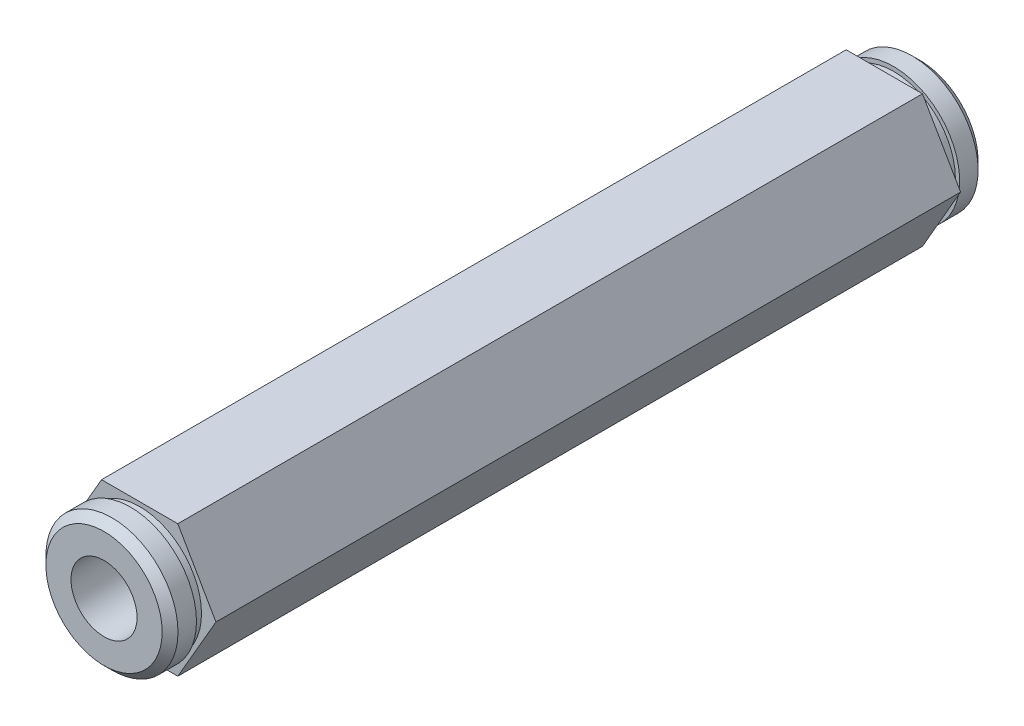
ISO-10303-21;
HEADER;
FILE_DESCRIPTION(('STEP AP214'),'2;1');
FILE_NAME('part.step','',(''),(''),'','','');
FILE_SCHEMA(('AUTOMOTIVE_DESIGN { 1 0 10303 214 1 1 1 1 }'));
ENDSEC;
DATA;
#1=APPLICATION_CONTEXT('core data for automotive mechanical design processes');
#2=APPLICATION_PROTOCOL_DEFINITION('international standard','automotive_design',2000,#1);
#3=PRODUCT_CONTEXT('',#1,'mechanical');
#4=PRODUCT('Part','Part','',(#3));
#5=PRODUCT_RELATED_PRODUCT_CATEGORY('part','',(#4));
#6=PRODUCT_DEFINITION_FORMATION('','',#4);
#7=PRODUCT_DEFINITION_CONTEXT('part definition',#1,'design');
#8=PRODUCT_DEFINITION('design','',#6,#7);
#9=PRODUCT_DEFINITION_SHAPE('','',#8);
#10=(LENGTH_UNIT() NAMED_UNIT(*) SI_UNIT(.MILLI.,.METRE.));
#11=(NAMED_UNIT(*) PLANE_ANGLE_UNIT() SI_UNIT($,.RADIAN.));
#12=(NAMED_UNIT(*) SI_UNIT($,.STERADIAN.) SOLID_ANGLE_UNIT());
#13=UNCERTAINTY_MEASURE_WITH_UNIT(LENGTH_MEASURE(1.E-05),#10,'distance_accuracy_value','');
#14=(GEOMETRIC_REPRESENTATION_CONTEXT(3) GLOBAL_UNCERTAINTY_ASSIGNED_CONTEXT((#13)) GLOBAL_UNIT_ASSIGNED_CONTEXT((#10,
#11,#12)) REPRESENTATION_CONTEXT('',''));
#15=CARTESIAN_POINT('',(0.,0.,0.));
#16=DIRECTION('',(0.,0.,1.));
#17=DIRECTION('',(1.,0.,0.));
#18=AXIS2_PLACEMENT_3D('',#15,#16,#17);
#19=CARTESIAN_POINT('',(0.,0.,57.3024));
#20=DIRECTION('',(0.,0.,1.));
#21=DIRECTION('',(1.,0.,0.));
#22=AXIS2_PLACEMENT_3D('',#19,#20,#21);
#23=PLANE('',#22);
#24=DIRECTION('',(-0.500000000000007,0.866025403784435,0.));
#25=VECTOR('',#24,1.);
#26=CARTESIAN_POINT('',(7.33234841870824,1.02782365951626E-13,57.3024));
#27=LINE('',#26,#25);
#28=CARTESIAN_POINT('',(7.33234841870824,1.02782365951626E-13,57.3024));
#29=VERTEX_POINT('',#28);
#30=CARTESIAN_POINT('',(3.6661742093541,6.35,57.3024));
#31=VERTEX_POINT('',#30);
#32=EDGE_CURVE('E121',#29,#31,#27,.T.);
#33=ORIENTED_EDGE('',*,*,#32,.T.);
#34=DIRECTION('',(-1.,0.,0.));
#35=VECTOR('',#34,1.);
#36=CARTESIAN_POINT('',(3.6661742093541,6.35,57.3024));
#37=LINE('',#36,#35);
#38=CARTESIAN_POINT('',(-3.66617420935415,6.34999999999998,57.3024));
#39=VERTEX_POINT('',#38);
#40=EDGE_CURVE('E126',#31,#39,#37,.T.);
#41=ORIENTED_EDGE('',*,*,#40,.T.);
#42=DIRECTION('',(-0.499999999999995,-0.866025403784442,0.));
#43=VECTOR('',#42,1.);
#44=CARTESIAN_POINT('',(-3.66617420935415,6.34999999999998,57.3024));
#45=LINE('',#44,#43);
#46=CARTESIAN_POINT('',(-7.33234841870824,0.,57.3024));
#47=VERTEX_POINT('',#46);
#48=EDGE_CURVE('E129',#39,#47,#45,.T.);
#49=ORIENTED_EDGE('',*,*,#48,.T.);
#50=DIRECTION('',(0.500000000000007,-0.866025403784435,0.));
#51=VECTOR('',#50,1.);
#52=CARTESIAN_POINT('',(-7.33234841870824,0.,57.3024));
#53=LINE('',#52,#51);
#54=CARTESIAN_POINT('',(-3.66617420935406,-6.35000000000003,57.3024));
#55=VERTEX_POINT('',#54);
#56=EDGE_CURVE('E132',#47,#55,#53,.T.);
#57=ORIENTED_EDGE('',*,*,#56,.T.);
#58=DIRECTION('',(1.,0.,0.));
#59=VECTOR('',#58,1.);
#60=CARTESIAN_POINT('',(-3.66617420935406,-6.35000000000003,57.3024));
#61=LINE('',#60,#59);
#62=CARTESIAN_POINT('',(3.66617420935419,-6.34999999999995,57.3024));
#63=VERTEX_POINT('',#62);
#64=EDGE_CURVE('E135',#55,#63,#61,.T.);
#65=ORIENTED_EDGE('',*,*,#64,.T.);
#66=DIRECTION('',(0.499999999999989,0.866025403784445,0.));
#67=VECTOR('',#66,1.);
#68=CARTESIAN_POINT('',(3.66617420935419,-6.34999999999995,57.3024));
#69=LINE('',#68,#67);
#70=EDGE_CURVE('E138',#63,#29,#69,.T.);
#71=ORIENTED_EDGE('',*,*,#70,.T.);
#72=EDGE_LOOP('',(#33,#41,#49,#57,#65,#71));
#73=FACE_BOUND('',#72,.T.);
#74=CARTESIAN_POINT('',(0.,0.,57.3024));
#75=DIRECTION('',(0.,0.,1.));
#76=DIRECTION('',(1.,0.,0.));
#77=AXIS2_PLACEMENT_3D('',#74,#75,#76);
#78=CIRCLE('',#77,5.9436);
#79=CARTESIAN_POINT('',(5.9436,0.,57.3024));
#80=VERTEX_POINT('',#79);
#81=EDGE_CURVE('E113',#80,#80,#78,.T.);
#82=ORIENTED_EDGE('',*,*,#81,.F.);
#83=EDGE_LOOP('',(#82));
#84=FACE_BOUND('',#83,.T.);
#85=ADVANCED_FACE('F45',(#73,#84),#23,.T.);
#86=CARTESIAN_POINT('',(0.,0.,-14.2875));
#87=DIRECTION('',(0.,0.,1.));
#88=DIRECTION('',(1.,0.,0.));
#89=AXIS2_PLACEMENT_3D('',#86,#87,#88);
#90=PLANE('',#89);
#91=DIRECTION('',(0.499999999999995,0.866025403784442,0.));
#92=VECTOR('',#91,1.);
#93=CARTESIAN_POINT('',(3.66617420935419,-6.34999999999995,-14.2875));
#94=LINE('',#93,#92);
#95=CARTESIAN_POINT('',(3.66617420935419,-6.34999999999995,-14.2875));
#96=VERTEX_POINT('',#95);
#97=CARTESIAN_POINT('',(7.33234841870824,0.,-14.2875));
#98=VERTEX_POINT('',#97);
#99=EDGE_CURVE('E147',#96,#98,#94,.T.);
#100=ORIENTED_EDGE('',*,*,#99,.F.);
#101=DIRECTION('',(1.,0.,0.));
#102=VECTOR('',#101,1.);
#103=CARTESIAN_POINT('',(-3.66617420935406,-6.35000000000002,-14.2875));
#104=LINE('',#103,#102);
#105=CARTESIAN_POINT('',(-3.66617420935406,-6.35000000000002,-14.2875));
#106=VERTEX_POINT('',#105);
#107=EDGE_CURVE('E60',#106,#96,#104,.T.);
#108=ORIENTED_EDGE('',*,*,#107,.F.);
#109=DIRECTION('',(0.500000000000007,-0.866025403784435,0.));
#110=VECTOR('',#109,1.);
#111=CARTESIAN_POINT('',(-7.33234841870824,0.,-14.2875));
#112=LINE('',#111,#110);
#113=CARTESIAN_POINT('',(-7.33234841870824,0.,-14.2875));
#114=VERTEX_POINT('',#113);
#115=EDGE_CURVE('E68',#114,#106,#112,.T.);
#116=ORIENTED_EDGE('',*,*,#115,.F.);
#117=DIRECTION('',(-0.499999999999995,-0.866025403784442,0.));
#118=VECTOR('',#117,1.);
#119=CARTESIAN_POINT('',(-3.66617420935415,6.34999999999997,-14.2875));
#120=LINE('',#119,#118);
#121=CARTESIAN_POINT('',(-3.66617420935415,6.34999999999997,-14.2875));
#122=VERTEX_POINT('',#121);
#123=EDGE_CURVE('E154',#122,#114,#120,.T.);
#124=ORIENTED_EDGE('',*,*,#123,.F.);
#125=DIRECTION('',(-1.,0.,0.));
#126=VECTOR('',#125,1.);
#127=CARTESIAN_POINT('',(3.6661742093541,6.35,-14.2875));
#128=LINE('',#127,#126);
#129=CARTESIAN_POINT('',(3.6661742093541,6.35,-14.2875));
#130=VERTEX_POINT('',#129);
#131=EDGE_CURVE('E152',#130,#122,#128,.T.);
#132=ORIENTED_EDGE('',*,*,#131,.F.);
#133=DIRECTION('',(-0.500000000000001,0.866025403784438,0.));
#134=VECTOR('',#133,1.);
#135=CARTESIAN_POINT('',(7.33234841870824,0.,-14.2875));
#136=LINE('',#135,#134);
#137=EDGE_CURVE('E150',#98,#130,#136,.T.);
#138=ORIENTED_EDGE('',*,*,#137,.F.);
#139=EDGE_LOOP('',(#100,#108,#116,#124,#132,#138));
#140=FACE_BOUND('',#139,.T.);
#141=CARTESIAN_POINT('',(0.,0.,-14.2875));
#142=DIRECTION('',(0.,0.,1.));
#143=DIRECTION('',(1.,0.,0.));
#144=AXIS2_PLACEMENT_3D('',#141,#142,#143);
#145=CIRCLE('',#144,5.9436);
#146=CARTESIAN_POINT('',(5.9436,0.,-14.2875));
#147=VERTEX_POINT('',#146);
#148=EDGE_CURVE('E173',#147,#147,#145,.F.);
#149=ORIENTED_EDGE('',*,*,#148,.F.);
#150=EDGE_LOOP('',(#149));
#151=FACE_BOUND('',#150,.T.);
#152=ADVANCED_FACE('F196',(#140,#151),#90,.F.);
#153=CARTESIAN_POINT('',(3.66617420935419,-6.34999999999995,14.2875));
#154=DIRECTION('',(-0.866025403784442,0.499999999999995,0.));
#155=DIRECTION('',(-0.499999999999995,-0.866025403784441,0.));
#156=AXIS2_PLACEMENT_3D('',#153,#154,#155);
#157=PLANE('',#156);
#158=ORIENTED_EDGE('',*,*,#99,.T.);
#159=DIRECTION('',(0.,0.,-1.));
#160=VECTOR('',#159,1.);
#161=CARTESIAN_POINT('',(7.33234841870824,0.,14.2875));
#162=LINE('',#161,#160);
#163=EDGE_CURVE('E170',#29,#98,#162,.T.);
#164=ORIENTED_EDGE('',*,*,#163,.F.);
#165=ORIENTED_EDGE('',*,*,#70,.F.);
#166=DIRECTION('',(0.,0.,-1.));
#167=VECTOR('',#166,1.);
#168=CARTESIAN_POINT('',(3.66617420935419,-6.34999999999995,14.2875));
#169=LINE('',#168,#167);
#170=EDGE_CURVE('E158',#63,#96,#169,.T.);
#171=ORIENTED_EDGE('',*,*,#170,.T.);
#172=EDGE_LOOP('',(#158,#164,#165,#171));
#173=FACE_BOUND('',#172,.T.);
#174=ADVANCED_FACE('F202',(#173),#157,.F.);
#175=CARTESIAN_POINT('',(7.33234841870824,0.,14.2875));
#176=DIRECTION('',(-0.866025403784438,-0.500000000000001,0.));
#177=DIRECTION('',(0.500000000000001,-0.866025403784438,0.));
#178=AXIS2_PLACEMENT_3D('',#175,#176,#177);
#179=PLANE('',#178);
#180=ORIENTED_EDGE('',*,*,#137,.T.);
#181=DIRECTION('',(0.,0.,-1.));
#182=VECTOR('',#181,1.);
#183=CARTESIAN_POINT('',(3.6661742093541,6.35,14.2875));
#184=LINE('',#183,#182);
#185=EDGE_CURVE('E167',#31,#130,#184,.T.);
#186=ORIENTED_EDGE('',*,*,#185,.F.);
#187=ORIENTED_EDGE('',*,*,#32,.F.);
#188=ORIENTED_EDGE('',*,*,#163,.T.);
#189=EDGE_LOOP('',(#180,#186,#187,#188));
#190=FACE_BOUND('',#189,.T.);
#191=ADVANCED_FACE('F240',(#190),#179,.F.);
#192=CARTESIAN_POINT('',(3.6661742093541,6.35,14.2875));
#193=DIRECTION('',(0.,-1.,0.));
#194=DIRECTION('',(1.,0.,0.));
#195=AXIS2_PLACEMENT_3D('',#192,#193,#194);
#196=PLANE('',#195);
#197=ORIENTED_EDGE('',*,*,#131,.T.);
#198=DIRECTION('',(0.,0.,-1.));
#199=VECTOR('',#198,1.);
#200=CARTESIAN_POINT('',(-3.66617420935415,6.34999999999997,14.2875));
#201=LINE('',#200,#199);
#202=EDGE_CURVE('E164',#39,#122,#201,.T.);
#203=ORIENTED_EDGE('',*,*,#202,.F.);
#204=ORIENTED_EDGE('',*,*,#40,.F.);
#205=ORIENTED_EDGE('',*,*,#185,.T.);
#206=EDGE_LOOP('',(#197,#203,#204,#205));
#207=FACE_BOUND('',#206,.T.);
#208=ADVANCED_FACE('F236',(#207),#196,.F.);
#209=CARTESIAN_POINT('',(-3.66617420935415,6.34999999999997,14.2875));
#210=DIRECTION('',(0.866025403784441,-0.499999999999995,0.));
#211=DIRECTION('',(0.499999999999995,0.866025403784442,0.));
#212=AXIS2_PLACEMENT_3D('',#209,#210,#211);
#213=PLANE('',#212);
#214=ORIENTED_EDGE('',*,*,#123,.T.);
#215=DIRECTION('',(0.,0.,-1.));
#216=VECTOR('',#215,1.);
#217=CARTESIAN_POINT('',(-7.33234841870824,0.,14.2875));
#218=LINE('',#217,#216);
#219=EDGE_CURVE('E162',#47,#114,#218,.T.);
#220=ORIENTED_EDGE('',*,*,#219,.F.);
#221=ORIENTED_EDGE('',*,*,#48,.F.);
#222=ORIENTED_EDGE('',*,*,#202,.T.);
#223=EDGE_LOOP('',(#214,#220,#221,#222));
#224=FACE_BOUND('',#223,.T.);
#225=ADVANCED_FACE('F233',(#224),#213,.F.);
#226=CARTESIAN_POINT('',(-7.33234841870824,0.,14.2875));
#227=DIRECTION('',(0.866025403784435,0.500000000000007,0.));
#228=DIRECTION('',(-0.500000000000007,0.866025403784435,0.));
#229=AXIS2_PLACEMENT_3D('',#226,#227,#228);
#230=PLANE('',#229);
#231=ORIENTED_EDGE('',*,*,#115,.T.);
#232=DIRECTION('',(0.,0.,-1.));
#233=VECTOR('',#232,1.);
#234=CARTESIAN_POINT('',(-3.66617420935406,-6.35000000000002,14.2875));
#235=LINE('',#234,#233);
#236=EDGE_CURVE('E160',#55,#106,#235,.T.);
#237=ORIENTED_EDGE('',*,*,#236,.F.);
#238=ORIENTED_EDGE('',*,*,#56,.F.);
#239=ORIENTED_EDGE('',*,*,#219,.T.);
#240=EDGE_LOOP('',(#231,#237,#238,#239));
#241=FACE_BOUND('',#240,.T.);
#242=ADVANCED_FACE('F230',(#241),#230,.F.);
#243=CARTESIAN_POINT('',(-3.66617420935406,-6.35000000000002,14.2875));
#244=DIRECTION('',(0.,1.,0.));
#245=DIRECTION('',(-1.,0.,0.));
#246=AXIS2_PLACEMENT_3D('',#243,#244,#245);
#247=PLANE('',#246);
#248=ORIENTED_EDGE('',*,*,#107,.T.);
#249=ORIENTED_EDGE('',*,*,#170,.F.);
#250=ORIENTED_EDGE('',*,*,#64,.F.);
#251=ORIENTED_EDGE('',*,*,#236,.T.);
#252=EDGE_LOOP('',(#248,#249,#250,#251));
#253=FACE_BOUND('',#252,.T.);
#254=ADVANCED_FACE('F225',(#253),#247,.F.);
#255=CARTESIAN_POINT('',(0.,0.,-15.1765));
#256=DIRECTION('',(0.,0.,1.));
#257=DIRECTION('',(1.,0.,0.));
#258=AXIS2_PLACEMENT_3D('',#255,#256,#257);
#259=CYLINDRICAL_SURFACE('',#258,5.9436);
#260=CARTESIAN_POINT('',(0.,0.,-15.1765));
#261=DIRECTION('',(0.,0.,-1.));
#262=DIRECTION('',(-1.,0.,0.));
#263=AXIS2_PLACEMENT_3D('',#260,#261,#262);
#264=CIRCLE('',#263,5.9436);
#265=CARTESIAN_POINT('',(-5.9436,0.,-15.1765));
#266=VERTEX_POINT('',#265);
#267=EDGE_CURVE('E144',#266,#266,#264,.T.);
#268=ORIENTED_EDGE('',*,*,#267,.F.);
#269=EDGE_LOOP('',(#268));
#270=FACE_BOUND('',#269,.T.);
#271=ORIENTED_EDGE('',*,*,#148,.T.);
#272=EDGE_LOOP('',(#271));
#273=FACE_BOUND('',#272,.T.);
#274=ADVANCED_FACE('F219',(#270,#273),#259,.T.);
#275=CARTESIAN_POINT('',(0.,0.,-15.1765));
#276=DIRECTION('',(0.,0.,-1.));
#277=DIRECTION('',(-1.,0.,0.));
#278=AXIS2_PLACEMENT_3D('',#275,#276,#277);
#279=PLANE('',#278);
#280=CARTESIAN_POINT('',(0.,0.,-15.1765));
#281=DIRECTION('',(0.,0.,-1.));
#282=DIRECTION('',(-1.,0.,0.));
#283=AXIS2_PLACEMENT_3D('',#280,#281,#282);
#284=CIRCLE('',#283,6.35);
#285=CARTESIAN_POINT('',(-6.35,0.,-15.1765));
#286=VERTEX_POINT('',#285);
#287=EDGE_CURVE('E141',#286,#286,#284,.T.);
#288=ORIENTED_EDGE('',*,*,#287,.F.);
#289=EDGE_LOOP('',(#288));
#290=FACE_BOUND('',#289,.T.);
#291=ORIENTED_EDGE('',*,*,#267,.T.);
#292=EDGE_LOOP('',(#291));
#293=FACE_BOUND('',#292,.T.);
#294=ADVANCED_FACE('F216',(#290,#293),#279,.F.);
#295=CARTESIAN_POINT('',(0.,0.,-17.7165));
#296=DIRECTION('',(0.,0.,1.));
#297=DIRECTION('',(1.,0.,0.));
#298=AXIS2_PLACEMENT_3D('',#295,#296,#297);
#299=CYLINDRICAL_SURFACE('',#298,6.35);
#300=CARTESIAN_POINT('',(0.,0.,-16.9545));
#301=DIRECTION('',(0.,0.,-1.));
#302=DIRECTION('',(-1.,0.,0.));
#303=AXIS2_PLACEMENT_3D('',#300,#301,#302);
#304=CIRCLE('',#303,6.35);
#305=CARTESIAN_POINT('',(-6.35,0.,-16.9545));
#306=VERTEX_POINT('',#305);
#307=EDGE_CURVE('E179',#306,#306,#304,.F.);
#308=ORIENTED_EDGE('',*,*,#307,.T.);
#309=EDGE_LOOP('',(#308));
#310=FACE_BOUND('',#309,.T.);
#311=ORIENTED_EDGE('',*,*,#287,.T.);
#312=EDGE_LOOP('',(#311));
#313=FACE_BOUND('',#312,.T.);
#314=ADVANCED_FACE('F214',(#310,#313),#299,.T.);
#315=CARTESIAN_POINT('',(0.,0.,-17.7165));
#316=DIRECTION('',(0.,0.,-1.));
#317=DIRECTION('',(-1.,0.,0.));
#318=AXIS2_PLACEMENT_3D('',#315,#316,#317);
#319=PLANE('',#318);
#320=CARTESIAN_POINT('',(0.,0.,-17.7165));
#321=DIRECTION('',(0.,0.,-1.));
#322=DIRECTION('',(-1.,0.,0.));
#323=AXIS2_PLACEMENT_3D('',#320,#321,#322);
#324=CIRCLE('',#323,5.588);
#325=CARTESIAN_POINT('',(-5.588,0.,-17.7165));
#326=VERTEX_POINT('',#325);
#327=EDGE_CURVE('E176',#326,#326,#324,.T.);
#328=ORIENTED_EDGE('',*,*,#327,.T.);
#329=EDGE_LOOP('',(#328));
#330=FACE_BOUND('',#329,.T.);
#331=ADVANCED_FACE('F210',(#330),#319,.T.);
#332=CARTESIAN_POINT('',(0.,0.,-17.7165));
#333=DIRECTION('',(0.,0.,1.));
#334=DIRECTION('',(1.,0.,0.));
#335=AXIS2_PLACEMENT_3D('',#332,#333,#334);
#336=CONICAL_SURFACE('',#335,5.588,0.785398163397445);
#337=ORIENTED_EDGE('',*,*,#307,.F.);
#338=EDGE_LOOP('',(#337));
#339=FACE_BOUND('',#338,.T.);
#340=ORIENTED_EDGE('',*,*,#327,.F.);
#341=EDGE_LOOP('',(#340));
#342=FACE_BOUND('',#341,.T.);
#343=ADVANCED_FACE('F213',(#339,#342),#336,.T.);
#344=CARTESIAN_POINT('',(0.,0.,58.1914));
#345=DIRECTION('',(0.,0.,-1.));
#346=DIRECTION('',(-1.,0.,0.));
#347=AXIS2_PLACEMENT_3D('',#344,#345,#346);
#348=CYLINDRICAL_SURFACE('',#347,5.9436);
#349=CARTESIAN_POINT('',(0.,0.,58.1914));
#350=DIRECTION('',(0.,0.,1.));
#351=DIRECTION('',(1.,0.,0.));
#352=AXIS2_PLACEMENT_3D('',#349,#350,#351);
#353=CIRCLE('',#352,5.9436);
#354=CARTESIAN_POINT('',(5.9436,0.,58.1914));
#355=VERTEX_POINT('',#354);
#356=EDGE_CURVE('E118',#355,#355,#353,.T.);
#357=ORIENTED_EDGE('',*,*,#356,.F.);
#358=EDGE_LOOP('',(#357));
#359=FACE_BOUND('',#358,.T.);
#360=ORIENTED_EDGE('',*,*,#81,.T.);
#361=EDGE_LOOP('',(#360));
#362=FACE_BOUND('',#361,.T.);
#363=ADVANCED_FACE('F208',(#359,#362),#348,.T.);
#364=CARTESIAN_POINT('',(0.,0.,58.1914));
#365=DIRECTION('',(0.,0.,1.));
#366=DIRECTION('',(1.,0.,0.));
#367=AXIS2_PLACEMENT_3D('',#364,#365,#366);
#368=PLANE('',#367);
#369=CARTESIAN_POINT('',(0.,0.,58.1914));
#370=DIRECTION('',(0.,0.,1.));
#371=DIRECTION('',(1.,0.,0.));
#372=AXIS2_PLACEMENT_3D('',#369,#370,#371);
#373=CIRCLE('',#372,6.35);
#374=CARTESIAN_POINT('',(6.35,0.,58.1914));
#375=VERTEX_POINT('',#374);
#376=EDGE_CURVE('E109',#375,#375,#373,.T.);
#377=ORIENTED_EDGE('',*,*,#376,.F.);
#378=EDGE_LOOP('',(#377));
#379=FACE_BOUND('',#378,.T.);
#380=ORIENTED_EDGE('',*,*,#356,.T.);
#381=EDGE_LOOP('',(#380));
#382=FACE_BOUND('',#381,.T.);
#383=ADVANCED_FACE('F252',(#379,#382),#368,.F.);
#384=CARTESIAN_POINT('',(0.,0.,60.7314));
#385=DIRECTION('',(0.,0.,-1.));
#386=DIRECTION('',(-1.,0.,0.));
#387=AXIS2_PLACEMENT_3D('',#384,#385,#386);
#388=CYLINDRICAL_SURFACE('',#387,6.35);
#389=CARTESIAN_POINT('',(0.,0.,59.9694));
#390=DIRECTION('',(0.,0.,1.));
#391=DIRECTION('',(1.,0.,0.));
#392=AXIS2_PLACEMENT_3D('',#389,#390,#391);
#393=CIRCLE('',#392,6.35);
#394=CARTESIAN_POINT('',(6.35,0.,59.9694));
#395=VERTEX_POINT('',#394);
#396=EDGE_CURVE('E13',#395,#395,#393,.F.);
#397=ORIENTED_EDGE('',*,*,#396,.T.);
#398=EDGE_LOOP('',(#397));
#399=FACE_BOUND('',#398,.T.);
#400=ORIENTED_EDGE('',*,*,#376,.T.);
#401=EDGE_LOOP('',(#400));
#402=FACE_BOUND('',#401,.T.);
#403=ADVANCED_FACE('F191',(#399,#402),#388,.T.);
#404=CARTESIAN_POINT('',(0.,0.,60.7314));
#405=DIRECTION('',(0.,0.,1.));
#406=DIRECTION('',(1.,0.,0.));
#407=AXIS2_PLACEMENT_3D('',#404,#405,#406);
#408=PLANE('',#407);
#409=CARTESIAN_POINT('',(0.,0.,60.7314));
#410=DIRECTION('',(0.,0.,1.));
#411=DIRECTION('',(1.,0.,0.));
#412=AXIS2_PLACEMENT_3D('',#409,#410,#411);
#413=CIRCLE('',#412,3.175);
#414=CARTESIAN_POINT('',(3.175,0.,60.7314));
#415=VERTEX_POINT('',#414);
#416=EDGE_CURVE('E110',#415,#415,#413,.T.);
#417=ORIENTED_EDGE('',*,*,#416,.F.);
#418=EDGE_LOOP('',(#417));
#419=FACE_BOUND('',#418,.T.);
#420=CARTESIAN_POINT('',(0.,0.,60.7314));
#421=DIRECTION('',(0.,0.,1.));
#422=DIRECTION('',(1.,0.,0.));
#423=AXIS2_PLACEMENT_3D('',#420,#421,#422);
#424=CIRCLE('',#423,5.58800000000002);
#425=CARTESIAN_POINT('',(5.58800000000002,0.,60.7314));
#426=VERTEX_POINT('',#425);
#427=EDGE_CURVE('E53',#426,#426,#424,.T.);
#428=ORIENTED_EDGE('',*,*,#427,.T.);
#429=EDGE_LOOP('',(#428));
#430=FACE_BOUND('',#429,.T.);
#431=ADVANCED_FACE('F184',(#419,#430),#408,.T.);
#432=CARTESIAN_POINT('',(0.,0.,60.7314));
#433=DIRECTION('',(0.,0.,-1.));
#434=DIRECTION('',(-1.,0.,0.));
#435=AXIS2_PLACEMENT_3D('',#432,#433,#434);
#436=CONICAL_SURFACE('',#435,5.58800000000002,0.785398163397443);
#437=ORIENTED_EDGE('',*,*,#396,.F.);
#438=EDGE_LOOP('',(#437));
#439=FACE_BOUND('',#438,.T.);
#440=ORIENTED_EDGE('',*,*,#427,.F.);
#441=EDGE_LOOP('',(#440));
#442=FACE_BOUND('',#441,.T.);
#443=ADVANCED_FACE('F47',(#439,#442),#436,.T.);
#444=CARTESIAN_POINT('',(0.,0.,54.3814));
#445=DIRECTION('',(0.,0.,1.));
#446=DIRECTION('',(1.,0.,0.));
#447=AXIS2_PLACEMENT_3D('',#444,#445,#446);
#448=CONICAL_SURFACE('',#447,3.175,1.02974425867665);
#449=CARTESIAN_POINT('',(0.,0.,52.4736675345875));
#450=VERTEX_POINT('',#449);
#451=VERTEX_LOOP('',#450);
#452=FACE_BOUND('',#451,.T.);
#453=CARTESIAN_POINT('',(0.,0.,54.3814));
#454=DIRECTION('',(0.,0.,1.));
#455=DIRECTION('',(1.,0.,0.));
#456=AXIS2_PLACEMENT_3D('',#453,#454,#455);
#457=CIRCLE('',#456,3.175);
#458=CARTESIAN_POINT('',(3.175,0.,54.3814));
#459=VERTEX_POINT('',#458);
#460=EDGE_CURVE('E107',#459,#459,#457,.T.);
#461=ORIENTED_EDGE('',*,*,#460,.T.);
#462=EDGE_LOOP('',(#461));
#463=FACE_BOUND('',#462,.T.);
#464=ADVANCED_FACE('F100',(#452,#463),#448,.F.);
#465=CARTESIAN_POINT('',(0.,0.,60.7314));
#466=DIRECTION('',(0.,0.,1.));
#467=DIRECTION('',(1.,0.,0.));
#468=AXIS2_PLACEMENT_3D('',#465,#466,#467);
#469=CYLINDRICAL_SURFACE('',#468,3.175);
#470=ORIENTED_EDGE('',*,*,#460,.F.);
#471=EDGE_LOOP('',(#470));
#472=FACE_BOUND('',#471,.T.);
#473=ORIENTED_EDGE('',*,*,#416,.T.);
#474=EDGE_LOOP('',(#473));
#475=FACE_BOUND('',#474,.T.);
#476=ADVANCED_FACE('F103',(#472,#475),#469,.F.);
#477=CLOSED_SHELL('',(#85,#152,#174,#191,#208,#225,#242,#254,#274,#294,#314,#331,#343,#363,#383,
#403,#431,#443,#464,#476));
#478=MANIFOLD_SOLID_BREP('B2',#477);
#479=ADVANCED_BREP_SHAPE_REPRESENTATION('',(#18,#478),#14);
#480=SHAPE_DEFINITION_REPRESENTATION(#9,#479);
ENDSEC;
END-ISO-10303-21;
